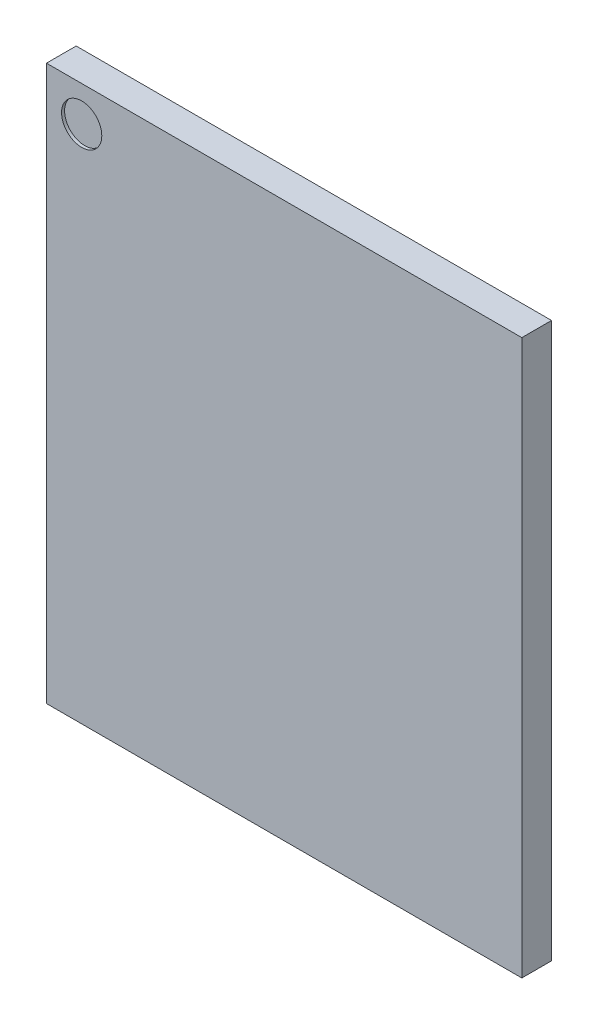
ISO-10303-21;
HEADER;
FILE_DESCRIPTION(('STEP AP214'),'2;1');
FILE_NAME('part.step','',(''),(''),'','','');
FILE_SCHEMA(('AUTOMOTIVE_DESIGN { 1 0 10303 214 1 1 1 1 }'));
ENDSEC;
DATA;
#1=APPLICATION_CONTEXT('core data for automotive mechanical design processes');
#2=APPLICATION_PROTOCOL_DEFINITION('international standard','automotive_design',2000,#1);
#3=PRODUCT_CONTEXT('',#1,'mechanical');
#4=PRODUCT('Part','Part','',(#3));
#5=PRODUCT_RELATED_PRODUCT_CATEGORY('part','',(#4));
#6=PRODUCT_DEFINITION_FORMATION('','',#4);
#7=PRODUCT_DEFINITION_CONTEXT('part definition',#1,'design');
#8=PRODUCT_DEFINITION('design','',#6,#7);
#9=PRODUCT_DEFINITION_SHAPE('','',#8);
#10=(LENGTH_UNIT() NAMED_UNIT(*) SI_UNIT(.MILLI.,.METRE.));
#11=(NAMED_UNIT(*) PLANE_ANGLE_UNIT() SI_UNIT($,.RADIAN.));
#12=(NAMED_UNIT(*) SI_UNIT($,.STERADIAN.) SOLID_ANGLE_UNIT());
#13=UNCERTAINTY_MEASURE_WITH_UNIT(LENGTH_MEASURE(1.E-05),#10,'distance_accuracy_value','');
#14=(GEOMETRIC_REPRESENTATION_CONTEXT(3) GLOBAL_UNCERTAINTY_ASSIGNED_CONTEXT((#13)) GLOBAL_UNIT_ASSIGNED_CONTEXT((#10,
#11,#12)) REPRESENTATION_CONTEXT('',''));
#15=CARTESIAN_POINT('',(0.,0.,0.));
#16=DIRECTION('',(0.,0.,1.));
#17=DIRECTION('',(1.,0.,0.));
#18=AXIS2_PLACEMENT_3D('',#15,#16,#17);
#19=CARTESIAN_POINT('',(0.,0.,0.93629999999976));
#20=DIRECTION('',(0.,0.,1.));
#21=DIRECTION('',(1.,0.,0.));
#22=AXIS2_PLACEMENT_3D('',#19,#20,#21);
#23=PLANE('',#22);
#24=CARTESIAN_POINT('',(-5.11099999999886,6.11099999999994,0.93629999999976));
#25=DIRECTION('',(0.,0.,1.));
#26=DIRECTION('',(1.,0.,0.));
#27=AXIS2_PLACEMENT_3D('',#24,#25,#26);
#28=CIRCLE('',#27,0.508);
#29=CARTESIAN_POINT('',(-4.60299999999886,6.11099999999994,0.93629999999976));
#30=VERTEX_POINT('',#29);
#31=EDGE_CURVE('E22',#30,#30,#28,.T.);
#32=ORIENTED_EDGE('',*,*,#31,.T.);
#33=EDGE_LOOP('',(#32));
#34=FACE_BOUND('',#33,.T.);
#35=ADVANCED_FACE('F19',(#34),#23,.T.);
#36=CARTESIAN_POINT('',(-5.11099999999886,6.11099999999994,1.01249999999976));
#37=DIRECTION('',(0.,0.,1.));
#38=DIRECTION('',(1.,0.,0.));
#39=AXIS2_PLACEMENT_3D('',#36,#37,#38);
#40=CYLINDRICAL_SURFACE('',#39,0.508);
#41=ORIENTED_EDGE('',*,*,#31,.F.);
#42=EDGE_LOOP('',(#41));
#43=FACE_BOUND('',#42,.T.);
#44=CARTESIAN_POINT('',(-5.11099999999886,6.11099999999994,1.01249999999976));
#45=DIRECTION('',(0.,0.,1.));
#46=DIRECTION('',(1.,0.,0.));
#47=AXIS2_PLACEMENT_3D('',#44,#45,#46);
#48=CIRCLE('',#47,0.508);
#49=CARTESIAN_POINT('',(-4.60299999999886,6.11099999999994,1.01249999999976));
#50=VERTEX_POINT('',#49);
#51=EDGE_CURVE('E77',#50,#50,#48,.F.);
#52=ORIENTED_EDGE('',*,*,#51,.F.);
#53=EDGE_LOOP('',(#52));
#54=FACE_BOUND('',#53,.T.);
#55=ADVANCED_FACE('F92',(#43,#54),#40,.F.);
#56=CARTESIAN_POINT('',(0.,0.,1.01249999999976));
#57=DIRECTION('',(0.,0.,1.));
#58=DIRECTION('',(1.,0.,0.));
#59=AXIS2_PLACEMENT_3D('',#56,#57,#58);
#60=PLANE('',#59);
#61=ORIENTED_EDGE('',*,*,#51,.T.);
#62=EDGE_LOOP('',(#61));
#63=FACE_BOUND('',#62,.T.);
#64=DIRECTION('',(1.,0.,0.));
#65=VECTOR('',#64,1.);
#66=CARTESIAN_POINT('',(5.99999999999886,6.99999999999994,1.01249999999976));
#67=LINE('',#66,#65);
#68=CARTESIAN_POINT('',(-5.99999999999886,6.99999999999994,1.01249999999976));
#69=VERTEX_POINT('',#68);
#70=CARTESIAN_POINT('',(5.99999999999886,6.99999999999994,1.01249999999976));
#71=VERTEX_POINT('',#70);
#72=EDGE_CURVE('E73',#69,#71,#67,.T.);
#73=ORIENTED_EDGE('',*,*,#72,.F.);
#74=DIRECTION('',(0.,1.,0.));
#75=VECTOR('',#74,1.);
#76=CARTESIAN_POINT('',(-5.99999999999886,6.99999999999994,1.01249999999976));
#77=LINE('',#76,#75);
#78=CARTESIAN_POINT('',(-5.99999999999886,-6.99999999999994,1.01249999999976));
#79=VERTEX_POINT('',#78);
#80=EDGE_CURVE('E69',#79,#69,#77,.T.);
#81=ORIENTED_EDGE('',*,*,#80,.F.);
#82=DIRECTION('',(1.,0.,0.));
#83=VECTOR('',#82,1.);
#84=CARTESIAN_POINT('',(-5.99999999999886,-6.99999999999994,1.01249999999976));
#85=LINE('',#84,#83);
#86=CARTESIAN_POINT('',(5.99999999999886,-6.99999999999994,1.01249999999976));
#87=VERTEX_POINT('',#86);
#88=EDGE_CURVE('E60',#87,#79,#85,.F.);
#89=ORIENTED_EDGE('',*,*,#88,.F.);
#90=DIRECTION('',(0.,1.,0.));
#91=VECTOR('',#90,1.);
#92=CARTESIAN_POINT('',(5.99999999999886,-6.99999999999994,1.01249999999976));
#93=LINE('',#92,#91);
#94=EDGE_CURVE('E55',#71,#87,#93,.F.);
#95=ORIENTED_EDGE('',*,*,#94,.F.);
#96=EDGE_LOOP('',(#73,#81,#89,#95));
#97=FACE_BOUND('',#96,.T.);
#98=ADVANCED_FACE('F72',(#63,#97),#60,.T.);
#99=CARTESIAN_POINT('',(-5.99999999999886,6.99999999999994,0.));
#100=DIRECTION('',(-1.,0.,0.));
#101=DIRECTION('',(0.,0.,1.));
#102=AXIS2_PLACEMENT_3D('',#99,#100,#101);
#103=PLANE('',#102);
#104=DIRECTION('',(0.,0.,1.));
#105=VECTOR('',#104,1.);
#106=CARTESIAN_POINT('',(-5.99999999999886,6.99999999999994,0.));
#107=LINE('',#106,#105);
#108=CARTESIAN_POINT('',(-5.99999999999886,6.99999999999994,0.262499999999966));
#109=VERTEX_POINT('',#108);
#110=EDGE_CURVE('E186',#109,#69,#107,.T.);
#111=ORIENTED_EDGE('',*,*,#110,.F.);
#112=DIRECTION('',(0.,1.,0.));
#113=VECTOR('',#112,1.);
#114=CARTESIAN_POINT('',(-5.99999999999886,0.,0.262499999999966));
#115=LINE('',#114,#113);
#116=CARTESIAN_POINT('',(-5.99999999999886,-6.99999999999994,0.262499999999966));
#117=VERTEX_POINT('',#116);
#118=EDGE_CURVE('E81',#109,#117,#115,.F.);
#119=ORIENTED_EDGE('',*,*,#118,.T.);
#120=DIRECTION('',(0.,0.,-1.));
#121=VECTOR('',#120,1.);
#122=CARTESIAN_POINT('',(-5.99999999999886,-6.99999999999994,0.));
#123=LINE('',#122,#121);
#124=EDGE_CURVE('E65',#79,#117,#123,.T.);
#125=ORIENTED_EDGE('',*,*,#124,.F.);
#126=ORIENTED_EDGE('',*,*,#80,.T.);
#127=EDGE_LOOP('',(#111,#119,#125,#126));
#128=FACE_BOUND('',#127,.T.);
#129=ADVANCED_FACE('F80',(#128),#103,.T.);
#130=CARTESIAN_POINT('',(-5.99999999999886,-6.99999999999994,0.));
#131=DIRECTION('',(0.,-1.,0.));
#132=DIRECTION('',(0.,0.,-1.));
#133=AXIS2_PLACEMENT_3D('',#130,#131,#132);
#134=PLANE('',#133);
#135=ORIENTED_EDGE('',*,*,#124,.T.);
#136=DIRECTION('',(1.,0.,0.));
#137=VECTOR('',#136,1.);
#138=CARTESIAN_POINT('',(0.,-6.99999999999994,0.262499999999966));
#139=LINE('',#138,#137);
#140=CARTESIAN_POINT('',(5.99999999999886,-6.99999999999994,0.262499999999966));
#141=VERTEX_POINT('',#140);
#142=EDGE_CURVE('E187',#117,#141,#139,.T.);
#143=ORIENTED_EDGE('',*,*,#142,.T.);
#144=DIRECTION('',(0.,0.,-1.));
#145=VECTOR('',#144,1.);
#146=CARTESIAN_POINT('',(5.99999999999886,-6.99999999999994,0.));
#147=LINE('',#146,#145);
#148=EDGE_CURVE('E67',#87,#141,#147,.T.);
#149=ORIENTED_EDGE('',*,*,#148,.F.);
#150=ORIENTED_EDGE('',*,*,#88,.T.);
#151=EDGE_LOOP('',(#135,#143,#149,#150));
#152=FACE_BOUND('',#151,.T.);
#153=ADVANCED_FACE('F62',(#152),#134,.T.);
#154=CARTESIAN_POINT('',(5.99999999999886,-6.99999999999994,0.));
#155=DIRECTION('',(1.,0.,0.));
#156=DIRECTION('',(0.,0.,-1.));
#157=AXIS2_PLACEMENT_3D('',#154,#155,#156);
#158=PLANE('',#157);
#159=ORIENTED_EDGE('',*,*,#148,.T.);
#160=DIRECTION('',(0.,1.,0.));
#161=VECTOR('',#160,1.);
#162=CARTESIAN_POINT('',(5.99999999999886,0.,0.262499999999966));
#163=LINE('',#162,#161);
#164=CARTESIAN_POINT('',(5.99999999999886,6.99999999999994,0.262499999999966));
#165=VERTEX_POINT('',#164);
#166=EDGE_CURVE('E28',#141,#165,#163,.T.);
#167=ORIENTED_EDGE('',*,*,#166,.T.);
#168=DIRECTION('',(0.,0.,1.));
#169=VECTOR('',#168,1.);
#170=CARTESIAN_POINT('',(5.99999999999886,6.99999999999994,0.));
#171=LINE('',#170,#169);
#172=EDGE_CURVE('E36',#71,#165,#171,.F.);
#173=ORIENTED_EDGE('',*,*,#172,.F.);
#174=ORIENTED_EDGE('',*,*,#94,.T.);
#175=EDGE_LOOP('',(#159,#167,#173,#174));
#176=FACE_BOUND('',#175,.T.);
#177=ADVANCED_FACE('F108',(#176),#158,.T.);
#178=CARTESIAN_POINT('',(5.99999999999886,6.99999999999994,0.));
#179=DIRECTION('',(0.,1.,0.));
#180=DIRECTION('',(0.,0.,1.));
#181=AXIS2_PLACEMENT_3D('',#178,#179,#180);
#182=PLANE('',#181);
#183=ORIENTED_EDGE('',*,*,#172,.T.);
#184=DIRECTION('',(1.,0.,0.));
#185=VECTOR('',#184,1.);
#186=CARTESIAN_POINT('',(0.,6.99999999999994,0.262499999999966));
#187=LINE('',#186,#185);
#188=EDGE_CURVE('E11',#165,#109,#187,.F.);
#189=ORIENTED_EDGE('',*,*,#188,.T.);
#190=ORIENTED_EDGE('',*,*,#110,.T.);
#191=ORIENTED_EDGE('',*,*,#72,.T.);
#192=EDGE_LOOP('',(#183,#189,#190,#191));
#193=FACE_BOUND('',#192,.T.);
#194=ADVANCED_FACE('F102',(#193),#182,.T.);
#195=CARTESIAN_POINT('',(0.,0.,0.262499999999966));
#196=DIRECTION('',(0.,0.,1.));
#197=DIRECTION('',(1.,0.,0.));
#198=AXIS2_PLACEMENT_3D('',#195,#196,#197);
#199=PLANE('',#198);
#200=ORIENTED_EDGE('',*,*,#166,.F.);
#201=ORIENTED_EDGE('',*,*,#142,.F.);
#202=ORIENTED_EDGE('',*,*,#118,.F.);
#203=ORIENTED_EDGE('',*,*,#188,.F.);
#204=EDGE_LOOP('',(#200,#201,#202,#203));
#205=FACE_BOUND('',#204,.T.);
#206=ADVANCED_FACE('F100',(#205),#199,.F.);
#207=CLOSED_SHELL('',(#35,#55,#98,#129,#153,#177,#194,#206));
#208=MANIFOLD_SOLID_BREP('B1',#207);
#209=ADVANCED_BREP_SHAPE_REPRESENTATION('',(#18,#208),#14);
#210=SHAPE_DEFINITION_REPRESENTATION(#9,#209);
ENDSEC;
END-ISO-10303-21;
